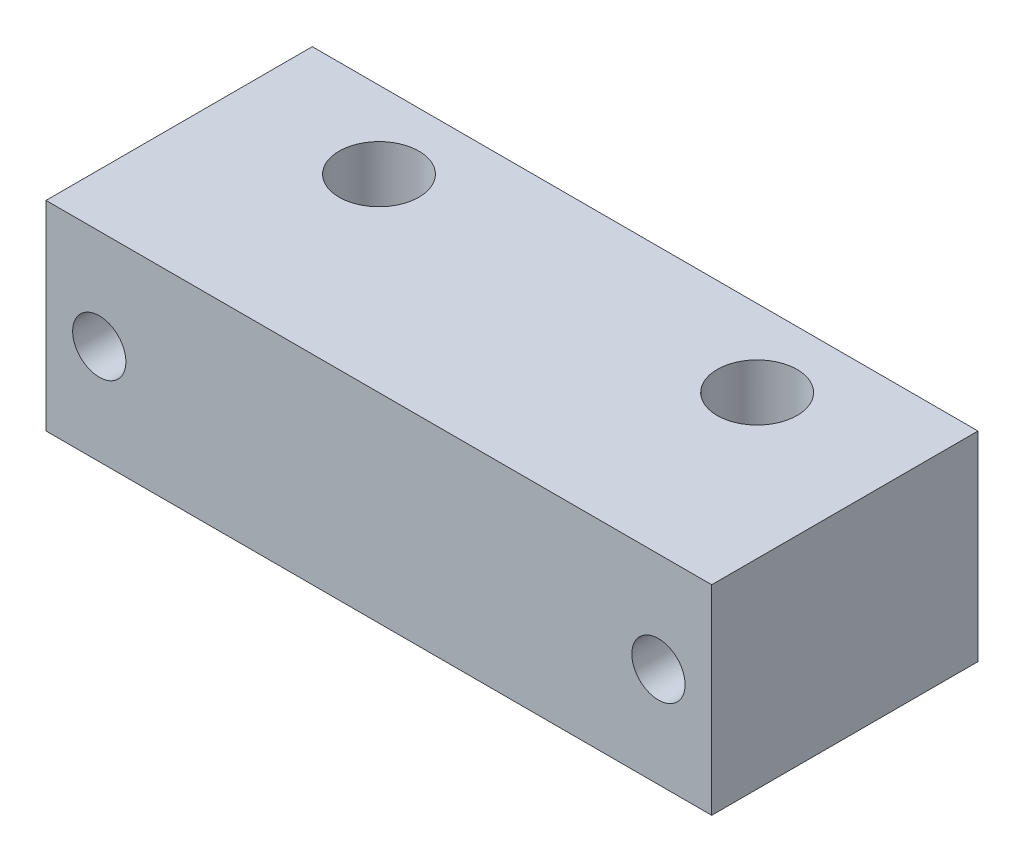
ISO-10303-21;
HEADER;
FILE_DESCRIPTION(('STEP AP214'),'2;1');
FILE_NAME('part.step','',(''),(''),'','','');
FILE_SCHEMA(('AUTOMOTIVE_DESIGN { 1 0 10303 214 1 1 1 1 }'));
ENDSEC;
DATA;
#1=APPLICATION_CONTEXT('core data for automotive mechanical design processes');
#2=APPLICATION_PROTOCOL_DEFINITION('international standard','automotive_design',2000,#1);
#3=PRODUCT_CONTEXT('',#1,'mechanical');
#4=PRODUCT('Part','Part','',(#3));
#5=PRODUCT_RELATED_PRODUCT_CATEGORY('part','',(#4));
#6=PRODUCT_DEFINITION_FORMATION('','',#4);
#7=PRODUCT_DEFINITION_CONTEXT('part definition',#1,'design');
#8=PRODUCT_DEFINITION('design','',#6,#7);
#9=PRODUCT_DEFINITION_SHAPE('','',#8);
#10=(LENGTH_UNIT() NAMED_UNIT(*) SI_UNIT(.MILLI.,.METRE.));
#11=(NAMED_UNIT(*) PLANE_ANGLE_UNIT() SI_UNIT($,.RADIAN.));
#12=(NAMED_UNIT(*) SI_UNIT($,.STERADIAN.) SOLID_ANGLE_UNIT());
#13=UNCERTAINTY_MEASURE_WITH_UNIT(LENGTH_MEASURE(1.E-05),#10,'distance_accuracy_value','');
#14=(GEOMETRIC_REPRESENTATION_CONTEXT(3) GLOBAL_UNCERTAINTY_ASSIGNED_CONTEXT((#13)) GLOBAL_UNIT_ASSIGNED_CONTEXT((#10,
#11,#12)) REPRESENTATION_CONTEXT('',''));
#15=CARTESIAN_POINT('',(0.,0.,0.));
#16=DIRECTION('',(0.,0.,1.));
#17=DIRECTION('',(1.,0.,0.));
#18=AXIS2_PLACEMENT_3D('',#15,#16,#17);
#19=CARTESIAN_POINT('',(49.441456613004,15.,0.));
#20=DIRECTION('',(1.,0.,0.));
#21=DIRECTION('',(0.,0.,-1.));
#22=AXIS2_PLACEMENT_3D('',#19,#20,#21);
#23=PLANE('',#22);
#24=DIRECTION('',(0.,0.,1.));
#25=VECTOR('',#24,1.);
#26=CARTESIAN_POINT('',(49.441456613004,0.,0.));
#27=LINE('',#26,#25);
#28=CARTESIAN_POINT('',(49.441456613004,0.,-41.));
#29=VERTEX_POINT('',#28);
#30=CARTESIAN_POINT('',(49.441456613004,0.,-21.));
#31=VERTEX_POINT('',#30);
#32=EDGE_CURVE('E116',#29,#31,#27,.T.);
#33=ORIENTED_EDGE('',*,*,#32,.F.);
#34=DIRECTION('',(0.,-1.,0.));
#35=VECTOR('',#34,1.);
#36=CARTESIAN_POINT('',(49.441456613004,15.,-41.));
#37=LINE('',#36,#35);
#38=CARTESIAN_POINT('',(49.441456613004,15.,-41.));
#39=VERTEX_POINT('',#38);
#40=EDGE_CURVE('E11',#39,#29,#37,.T.);
#41=ORIENTED_EDGE('',*,*,#40,.F.);
#42=DIRECTION('',(0.,0.,1.));
#43=VECTOR('',#42,1.);
#44=CARTESIAN_POINT('',(49.441456613004,15.,0.));
#45=LINE('',#44,#43);
#46=CARTESIAN_POINT('',(49.441456613004,15.,-21.));
#47=VERTEX_POINT('',#46);
#48=EDGE_CURVE('E101',#39,#47,#45,.T.);
#49=ORIENTED_EDGE('',*,*,#48,.T.);
#50=DIRECTION('',(0.,-1.,0.));
#51=VECTOR('',#50,1.);
#52=CARTESIAN_POINT('',(49.441456613004,15.,-21.));
#53=LINE('',#52,#51);
#54=EDGE_CURVE('E61',#47,#31,#53,.T.);
#55=ORIENTED_EDGE('',*,*,#54,.T.);
#56=EDGE_LOOP('',(#33,#41,#49,#55));
#57=FACE_BOUND('',#56,.T.);
#58=ADVANCED_FACE('F37',(#57),#23,.T.);
#59=CARTESIAN_POINT('',(0.,15.,-41.));
#60=DIRECTION('',(0.,0.,-1.));
#61=DIRECTION('',(-1.,0.,0.));
#62=AXIS2_PLACEMENT_3D('',#59,#60,#61);
#63=PLANE('',#62);
#64=CARTESIAN_POINT('',(10.241456613004,7.5,-41.));
#65=DIRECTION('',(0.,0.,-1.));
#66=DIRECTION('',(-1.,0.,0.));
#67=AXIS2_PLACEMENT_3D('',#64,#65,#66);
#68=CIRCLE('',#67,2.);
#69=CARTESIAN_POINT('',(8.24145661300399,7.5,-41.));
#70=VERTEX_POINT('',#69);
#71=EDGE_CURVE('E132',#70,#70,#68,.T.);
#72=ORIENTED_EDGE('',*,*,#71,.F.);
#73=EDGE_LOOP('',(#72));
#74=FACE_BOUND('',#73,.T.);
#75=CARTESIAN_POINT('',(38.641456613004,7.5,-41.));
#76=DIRECTION('',(0.,0.,-1.));
#77=DIRECTION('',(-1.,0.,0.));
#78=AXIS2_PLACEMENT_3D('',#75,#76,#77);
#79=CIRCLE('',#78,2.);
#80=CARTESIAN_POINT('',(36.641456613004,7.5,-41.));
#81=VERTEX_POINT('',#80);
#82=EDGE_CURVE('E199',#81,#81,#79,.T.);
#83=ORIENTED_EDGE('',*,*,#82,.F.);
#84=EDGE_LOOP('',(#83));
#85=FACE_BOUND('',#84,.T.);
#86=CARTESIAN_POINT('',(3.44145661300399,7.5,-41.));
#87=DIRECTION('',(0.,0.,-1.));
#88=DIRECTION('',(-1.,0.,0.));
#89=AXIS2_PLACEMENT_3D('',#86,#87,#88);
#90=CIRCLE('',#89,2.);
#91=CARTESIAN_POINT('',(1.44145661300399,7.5,-41.));
#92=VERTEX_POINT('',#91);
#93=EDGE_CURVE('E194',#92,#92,#90,.T.);
#94=ORIENTED_EDGE('',*,*,#93,.F.);
#95=EDGE_LOOP('',(#94));
#96=FACE_BOUND('',#95,.T.);
#97=CARTESIAN_POINT('',(45.441456613004,7.5,-41.));
#98=DIRECTION('',(0.,0.,-1.));
#99=DIRECTION('',(-1.,0.,0.));
#100=AXIS2_PLACEMENT_3D('',#97,#98,#99);
#101=CIRCLE('',#100,2.);
#102=CARTESIAN_POINT('',(43.441456613004,7.5,-41.));
#103=VERTEX_POINT('',#102);
#104=EDGE_CURVE('E188',#103,#103,#101,.T.);
#105=ORIENTED_EDGE('',*,*,#104,.F.);
#106=EDGE_LOOP('',(#105));
#107=FACE_BOUND('',#106,.T.);
#108=DIRECTION('',(1.,0.,0.));
#109=VECTOR('',#108,1.);
#110=CARTESIAN_POINT('',(0.,0.,-41.));
#111=LINE('',#110,#109);
#112=CARTESIAN_POINT('',(-0.558543386996006,0.,-41.));
#113=VERTEX_POINT('',#112);
#114=EDGE_CURVE('E91',#113,#29,#111,.T.);
#115=ORIENTED_EDGE('',*,*,#114,.F.);
#116=DIRECTION('',(0.,-1.,0.));
#117=VECTOR('',#116,1.);
#118=CARTESIAN_POINT('',(-0.558543386996006,15.,-41.));
#119=LINE('',#118,#117);
#120=CARTESIAN_POINT('',(-0.558543386996006,15.,-41.));
#121=VERTEX_POINT('',#120);
#122=EDGE_CURVE('E52',#121,#113,#119,.T.);
#123=ORIENTED_EDGE('',*,*,#122,.F.);
#124=DIRECTION('',(1.,0.,0.));
#125=VECTOR('',#124,1.);
#126=CARTESIAN_POINT('',(0.,15.,-41.));
#127=LINE('',#126,#125);
#128=EDGE_CURVE('E89',#121,#39,#127,.T.);
#129=ORIENTED_EDGE('',*,*,#128,.T.);
#130=ORIENTED_EDGE('',*,*,#40,.T.);
#131=EDGE_LOOP('',(#115,#123,#129,#130));
#132=FACE_BOUND('',#131,.T.);
#133=ADVANCED_FACE('F88',(#74,#85,#96,#107,#132),#63,.T.);
#134=CARTESIAN_POINT('',(-0.558543386996006,15.,0.));
#135=DIRECTION('',(-1.,0.,0.));
#136=DIRECTION('',(0.,0.,1.));
#137=AXIS2_PLACEMENT_3D('',#134,#135,#136);
#138=PLANE('',#137);
#139=DIRECTION('',(0.,0.,-1.));
#140=VECTOR('',#139,1.);
#141=CARTESIAN_POINT('',(-0.558543386996006,0.,0.));
#142=LINE('',#141,#140);
#143=CARTESIAN_POINT('',(-0.558543386996006,0.,-21.));
#144=VERTEX_POINT('',#143);
#145=EDGE_CURVE('E119',#144,#113,#142,.T.);
#146=ORIENTED_EDGE('',*,*,#145,.F.);
#147=DIRECTION('',(0.,-1.,0.));
#148=VECTOR('',#147,1.);
#149=CARTESIAN_POINT('',(-0.558543386996006,15.,-21.));
#150=LINE('',#149,#148);
#151=CARTESIAN_POINT('',(-0.558543386996006,15.,-21.));
#152=VERTEX_POINT('',#151);
#153=EDGE_CURVE('E74',#152,#144,#150,.T.);
#154=ORIENTED_EDGE('',*,*,#153,.F.);
#155=DIRECTION('',(0.,0.,-1.));
#156=VECTOR('',#155,1.);
#157=CARTESIAN_POINT('',(-0.558543386996006,15.,0.));
#158=LINE('',#157,#156);
#159=EDGE_CURVE('E100',#152,#121,#158,.T.);
#160=ORIENTED_EDGE('',*,*,#159,.T.);
#161=ORIENTED_EDGE('',*,*,#122,.T.);
#162=EDGE_LOOP('',(#146,#154,#160,#161));
#163=FACE_BOUND('',#162,.T.);
#164=ADVANCED_FACE('F103',(#163),#138,.T.);
#165=CARTESIAN_POINT('',(10.241456613004,15.,-35.2107775480874));
#166=DIRECTION('',(0.,-1.,0.));
#167=DIRECTION('',(0.,0.,-1.));
#168=AXIS2_PLACEMENT_3D('',#165,#166,#167);
#169=CYLINDRICAL_SURFACE('',#168,3.);
#170=CARTESIAN_POINT('',(10.241456613004,9.5,-38.2107775480874));
#171=CARTESIAN_POINT('',(10.1409718963359,9.50000054963247,-38.2107779645358));
#172=CARTESIAN_POINT('',(10.0404875258711,9.4923860300445,-38.2056855756213));
#173=CARTESIAN_POINT('',(9.84272355497231,9.46240313589434,-38.1858240723255));
#174=CARTESIAN_POINT('',(9.74544549904899,9.4400277568767,-38.1710503638998));
#175=CARTESIAN_POINT('',(9.55724430514974,9.38189228267516,-38.1332823721345));
#176=CARTESIAN_POINT('',(9.46629374034644,9.34619485999206,-38.1103266030206));
#177=CARTESIAN_POINT('',(9.29204132200673,9.2629366367285,-38.0580389268618));
#178=CARTESIAN_POINT('',(9.20874058139432,9.21537411369943,-38.0287060941425));
#179=CARTESIAN_POINT('',(9.04417191223388,9.10534306263257,-37.9630508417858));
#180=CARTESIAN_POINT('',(8.96367630754332,9.0419521392571,-37.9263465238806));
#181=CARTESIAN_POINT('',(8.81372856831125,8.90426995134155,-37.8506006789221));
#182=CARTESIAN_POINT('',(8.74429255756511,8.82996307016226,-37.8115558516558));
#183=CARTESIAN_POINT('',(8.60723363554903,8.65894763238732,-37.7280601948754));
#184=CARTESIAN_POINT('',(8.54162474937649,8.56055434679654,-37.6837282274654));
#185=CARTESIAN_POINT('',(8.42795304286225,8.35163662235346,-37.6016190216156));
#186=CARTESIAN_POINT('',(8.37985987873897,8.24113359843725,-37.5638305076341));
#187=CARTESIAN_POINT('',(8.31471626288961,8.04328870657837,-37.510540214502));
#188=CARTESIAN_POINT('',(8.29271214064391,7.95847154712609,-37.4917538270115));
#189=CARTESIAN_POINT('',(8.25995043515171,7.78525549525835,-37.4633572446835));
#190=CARTESIAN_POINT('',(8.24917346648436,7.69686305127394,-37.4537312355289));
#191=CARTESIAN_POINT('',(8.23954297159172,7.51852522114353,-37.4451436041679));
#192=CARTESIAN_POINT('',(8.24073818382876,7.4285749765476,-37.4462255736725));
#193=CARTESIAN_POINT('',(8.25508079967044,7.25036502650024,-37.4589753029217));
#194=CARTESIAN_POINT('',(8.26823832920007,7.16210681797187,-37.4706520309562));
#195=CARTESIAN_POINT('',(8.30480667083074,6.99353294875812,-37.502049407987));
#196=CARTESIAN_POINT('',(8.32773949820922,6.91303866406123,-37.5213924313312));
#197=CARTESIAN_POINT('',(8.38275542716976,6.75697630902422,-37.5658737774237));
#198=CARTESIAN_POINT('',(8.41484153971849,6.68140986976135,-37.5910140066363));
#199=CARTESIAN_POINT('',(8.49471842567751,6.52097460464355,-37.6504195118669));
#200=CARTESIAN_POINT('',(8.54437608999955,6.4373400995169,-37.6855007254937));
#201=CARTESIAN_POINT('',(8.65476700862179,6.27861660471425,-37.7576929254218));
#202=CARTESIAN_POINT('',(8.71551392300786,6.20353834223792,-37.7948063751807));
#203=CARTESIAN_POINT('',(8.86164495978091,6.04745745439658,-37.8762109857247));
#204=CARTESIAN_POINT('',(8.94951723016744,5.96866595131723,-37.920324995293));
#205=CARTESIAN_POINT('',(9.13944861392392,5.82680350546151,-38.0029585547395));
#206=CARTESIAN_POINT('',(9.2414943136603,5.76371785459102,-38.0414833245678));
#207=CARTESIAN_POINT('',(9.43659878590747,5.66652228137713,-38.1022315889911));
#208=CARTESIAN_POINT('',(9.52749896963208,5.62915663666106,-38.1261701597428));
#209=CARTESIAN_POINT('',(9.71542056906851,5.56789507437463,-38.1658547383924));
#210=CARTESIAN_POINT('',(9.81243673400234,5.54398777286778,-38.1816076693629));
#211=CARTESIAN_POINT('',(10.0104711598317,5.510838834762,-38.2035363696555));
#212=CARTESIAN_POINT('',(10.1115048010698,5.50166053906174,-38.2096707726993));
#213=CARTESIAN_POINT('',(10.3138981323933,5.49875291143779,-38.2116086977389));
#214=CARTESIAN_POINT('',(10.4152577991906,5.50502249951123,-38.2074129419438));
#215=CARTESIAN_POINT('',(10.6079123302082,5.53162405556195,-38.1897734423302));
#216=CARTESIAN_POINT('',(10.6994140576832,5.55093729775522,-38.1770000119897));
#217=CARTESIAN_POINT('',(10.8775730054314,5.60159568601286,-38.1439620409358));
#218=CARTESIAN_POINT('',(10.9642294505751,5.63294275092821,-38.1236963055573));
#219=CARTESIAN_POINT('',(11.13612136347,5.70865229704492,-38.075741073379));
#220=CARTESIAN_POINT('',(11.2209527976354,5.75368815408185,-38.0476762494453));
#221=CARTESIAN_POINT('',(11.3821396369613,5.85443328994627,-37.9867961042025));
#222=CARTESIAN_POINT('',(11.4584897612049,5.91014916053217,-37.9539778521268));
#223=CARTESIAN_POINT('',(11.6133110678272,6.04060786815751,-37.8803230146217));
#224=CARTESIAN_POINT('',(11.6902084886996,6.11696626007509,-37.8390391160891));
#225=CARTESIAN_POINT('',(11.8307962936985,6.28111142995711,-37.756489278947));
#226=CARTESIAN_POINT('',(11.8944775495763,6.3689060391075,-37.7152233722659));
#227=CARTESIAN_POINT('',(12.0027043784971,6.54714241276812,-37.6401743377932));
#228=CARTESIAN_POINT('',(12.0484129742568,6.63673203346221,-37.6060535183444));
#229=CARTESIAN_POINT('',(12.1264187504066,6.82387265244363,-37.545167290749));
#230=CARTESIAN_POINT('',(12.1587400698259,6.92140893830463,-37.5183886733856));
#231=CARTESIAN_POINT('',(12.2038150476574,7.10456448719541,-37.4801096299138));
#232=CARTESIAN_POINT('',(12.2190425886662,7.18917180987601,-37.4667275283));
#233=CARTESIAN_POINT('',(12.2384486722377,7.36057328131839,-37.4495722124714));
#234=CARTESIAN_POINT('',(12.2426392158572,7.4473649511395,-37.4457885615656));
#235=CARTESIAN_POINT('',(12.2396958328167,7.6206430567237,-37.4484195595873));
#236=CARTESIAN_POINT('',(12.2325552006818,7.70712928137376,-37.4548402471621));
#237=CARTESIAN_POINT('',(12.2074265852515,7.87734352853212,-37.4768820721223));
#238=CARTESIAN_POINT('',(12.1894241302866,7.96106771382433,-37.4925154833636));
#239=CARTESIAN_POINT('',(12.1373869695789,8.14571118648124,-37.5360459871354));
#240=CARTESIAN_POINT('',(12.1003584843116,8.24526771294333,-37.5661008838373));
#241=CARTESIAN_POINT('',(12.0123018753662,8.43548683438421,-37.6329991593005));
#242=CARTESIAN_POINT('',(11.9612540964166,8.52613669799169,-37.6698520449544));
#243=CARTESIAN_POINT('',(11.8454394185555,8.69928188713623,-37.7469494138586));
#244=CARTESIAN_POINT('',(11.7804397119442,8.78159874542305,-37.7872434220102));
#245=CARTESIAN_POINT('',(11.6381742933149,8.93532247825793,-37.8670605634659));
#246=CARTESIAN_POINT('',(11.5609048232615,9.00672599702921,-37.9065834564114));
#247=CARTESIAN_POINT('',(11.3829139427737,9.14671210430908,-37.9870930677283));
#248=CARTESIAN_POINT('',(11.2804182825597,9.21341864017832,-38.0274756025873));
#249=CARTESIAN_POINT('',(11.0623251687752,9.3279132766653,-38.098554206829));
#250=CARTESIAN_POINT('',(10.9467486754531,9.37573110682395,-38.12926548254));
#251=CARTESIAN_POINT('',(10.7328916828397,9.44115457816378,-38.1717939964564));
#252=CARTESIAN_POINT('',(10.6364689382619,9.46311103909862,-38.1862923517768));
#253=CARTESIAN_POINT('',(10.4405146250279,9.49252803253809,-38.205780349506));
#254=CARTESIAN_POINT('',(10.340985449192,9.49999945559601,-38.2107771356006));
#255=CARTESIAN_POINT('',(10.241456613004,9.5,-38.2107775480874));
#256=B_SPLINE_CURVE_WITH_KNOTS('',3,(#170,#171,#172,#173,#174,#175,#176,#177,#178,#179,#180,
#181,#182,#183,#184,#185,#186,#187,#188,#189,#190,#191,#192,#193,#194,#195,#196,#197,#198,#199,
#200,#201,#202,#203,#204,#205,#206,#207,#208,#209,#210,#211,#212,#213,#214,#215,#216,#217,#218,
#219,#220,#221,#222,#223,#224,#225,#226,#227,#228,#229,#230,#231,#232,#233,#234,#235,#236,#237,
#238,#239,#240,#241,#242,#243,#244,#245,#246,#247,#248,#249,#250,#251,#252,#253,#254,#255),
.UNSPECIFIED.,.T.,.F.,(4,2,2,2,2,2,2,2,2,2,2,2,2,2,2,2,2,2,2,2,2,2,2,2,2,2,2,2,2,2,2,2,2,2,2,2,
2,2,2,2,2,2,4),(0.,0.301053226505399,0.602249414348689,0.902046153190232,1.20188643867387,
1.52717029000557,1.85292411604319,2.23006683295982,2.60655305445439,2.87433693676029,
3.14165767845809,3.41006711735378,3.67870397263352,3.93548862198021,4.19235783805078,
4.50147574660873,4.81097703780057,5.18718954496752,5.56304840301362,5.86524087696757,
6.16717735142812,6.4704088329425,6.77361911533414,7.05553084792471,7.33748755138269,
7.63652346829515,7.93574454945203,8.2822817614129,8.62905753175757,8.94649935304475,
9.26336626640722,9.52324048016134,9.7828320033309,10.0425772028455,10.302669238524,
10.6320660870419,10.9619271337795,11.2977924520448,11.6337608397015,12.0179535155883,
12.4015390656082,12.6999529136674,12.9981423125957),.UNSPECIFIED.);
#257=CARTESIAN_POINT('',(10.241456613004,9.5,-38.2107775480874));
#258=VERTEX_POINT('',#257);
#259=EDGE_CURVE('E42',#258,#258,#256,.T.);
#260=ORIENTED_EDGE('',*,*,#259,.F.);
#261=EDGE_LOOP('',(#260));
#262=FACE_BOUND('',#261,.T.);
#263=CARTESIAN_POINT('',(10.241456613004,15.,-35.2107775480874));
#264=DIRECTION('',(0.,1.,0.));
#265=DIRECTION('',(0.,0.,1.));
#266=AXIS2_PLACEMENT_3D('',#263,#264,#265);
#267=CIRCLE('',#266,3.);
#268=CARTESIAN_POINT('',(10.241456613004,15.,-32.2107775480874));
#269=VERTEX_POINT('',#268);
#270=EDGE_CURVE('E179',#269,#269,#267,.T.);
#271=ORIENTED_EDGE('',*,*,#270,.T.);
#272=EDGE_LOOP('',(#271));
#273=FACE_BOUND('',#272,.T.);
#274=CARTESIAN_POINT('',(10.241456613004,0.,-35.2107775480874));
#275=DIRECTION('',(0.,1.,0.));
#276=DIRECTION('',(0.,0.,1.));
#277=AXIS2_PLACEMENT_3D('',#274,#275,#276);
#278=CIRCLE('',#277,3.);
#279=CARTESIAN_POINT('',(10.241456613004,0.,-32.2107775480874));
#280=VERTEX_POINT('',#279);
#281=EDGE_CURVE('E112',#280,#280,#278,.T.);
#282=ORIENTED_EDGE('',*,*,#281,.F.);
#283=EDGE_LOOP('',(#282));
#284=FACE_BOUND('',#283,.T.);
#285=ADVANCED_FACE('F161',(#262,#273,#284),#169,.F.);
#286=CARTESIAN_POINT('',(38.641456613004,15.,-35.2107775480874));
#287=DIRECTION('',(0.,-1.,0.));
#288=DIRECTION('',(0.,0.,-1.));
#289=AXIS2_PLACEMENT_3D('',#286,#287,#288);
#290=CYLINDRICAL_SURFACE('',#289,3.);
#291=CARTESIAN_POINT('',(38.641456613004,9.5,-38.2107775480874));
#292=CARTESIAN_POINT('',(38.5409718963359,9.50000054963247,-38.2107779645358));
#293=CARTESIAN_POINT('',(38.4404875258711,9.4923860300445,-38.2056855756213));
#294=CARTESIAN_POINT('',(38.2427235549723,9.46240313589434,-38.1858240723255));
#295=CARTESIAN_POINT('',(38.145445499049,9.44002775687671,-38.1710503638998));
#296=CARTESIAN_POINT('',(37.9572443051498,9.38189228267516,-38.1332823721345));
#297=CARTESIAN_POINT('',(37.8662937403464,9.34619485999206,-38.1103266030206));
#298=CARTESIAN_POINT('',(37.6920413220067,9.2629366367285,-38.0580389268618));
#299=CARTESIAN_POINT('',(37.6087405813943,9.21537411369944,-38.0287060941425));
#300=CARTESIAN_POINT('',(37.4441719122339,9.10534306263257,-37.9630508417858));
#301=CARTESIAN_POINT('',(37.3636763075433,9.0419521392571,-37.9263465238806));
#302=CARTESIAN_POINT('',(37.2137285683113,8.90426995134155,-37.8506006789221));
#303=CARTESIAN_POINT('',(37.1442925575651,8.82996307016226,-37.8115558516558));
#304=CARTESIAN_POINT('',(37.007233635549,8.65894763238732,-37.7280601948754));
#305=CARTESIAN_POINT('',(36.9416247493765,8.56055434679654,-37.6837282274654));
#306=CARTESIAN_POINT('',(36.8279530428622,8.35163662235346,-37.6016190216156));
#307=CARTESIAN_POINT('',(36.779859878739,8.24113359843725,-37.5638305076341));
#308=CARTESIAN_POINT('',(36.7147162628896,8.04328870657836,-37.510540214502));
#309=CARTESIAN_POINT('',(36.6927121406439,7.95847154712608,-37.4917538270115));
#310=CARTESIAN_POINT('',(36.6599504351517,7.78525549525834,-37.4633572446835));
#311=CARTESIAN_POINT('',(36.6491734664844,7.69686305127393,-37.4537312355289));
#312=CARTESIAN_POINT('',(36.6395429715917,7.51852522114352,-37.4451436041679));
#313=CARTESIAN_POINT('',(36.6407381838288,7.42857497654759,-37.4462255736725));
#314=CARTESIAN_POINT('',(36.6550807996704,7.25036502650024,-37.4589753029217));
#315=CARTESIAN_POINT('',(36.6682383292001,7.16210681797186,-37.4706520309563));
#316=CARTESIAN_POINT('',(36.7048066708307,6.99353294875811,-37.502049407987));
#317=CARTESIAN_POINT('',(36.7277394982092,6.91303866406122,-37.5213924313312));
#318=CARTESIAN_POINT('',(36.7827554271698,6.75697630902421,-37.5658737774237));
#319=CARTESIAN_POINT('',(36.8148415397185,6.68140986976134,-37.5910140066363));
#320=CARTESIAN_POINT('',(36.8947184256775,6.52097460464355,-37.6504195118669));
#321=CARTESIAN_POINT('',(36.9443760899996,6.43734009951689,-37.6855007254937));
#322=CARTESIAN_POINT('',(37.0547670086218,6.27861660471424,-37.7576929254218));
#323=CARTESIAN_POINT('',(37.1155139230079,6.20353834223792,-37.7948063751807));
#324=CARTESIAN_POINT('',(37.2616449597809,6.04745745439657,-37.8762109857247));
#325=CARTESIAN_POINT('',(37.3495172301674,5.96866595131723,-37.9203249952931));
#326=CARTESIAN_POINT('',(37.5394486139239,5.82680350546151,-38.0029585547396));
#327=CARTESIAN_POINT('',(37.6414943136603,5.76371785459101,-38.0414833245679));
#328=CARTESIAN_POINT('',(37.8365987859075,5.66652228137712,-38.1022315889911));
#329=CARTESIAN_POINT('',(37.9274989696321,5.62915663666106,-38.1261701597428));
#330=CARTESIAN_POINT('',(38.1154205690685,5.56789507437463,-38.1658547383924));
#331=CARTESIAN_POINT('',(38.2124367340024,5.54398777286778,-38.1816076693629));
#332=CARTESIAN_POINT('',(38.4104711598317,5.510838834762,-38.2035363696555));
#333=CARTESIAN_POINT('',(38.5115048010699,5.50166053906174,-38.2096707726993));
#334=CARTESIAN_POINT('',(38.7138981323933,5.49875291143779,-38.2116086977389));
#335=CARTESIAN_POINT('',(38.8152577991906,5.50502249951122,-38.2074129419438));
#336=CARTESIAN_POINT('',(39.0079123302082,5.53162405556195,-38.1897734423302));
#337=CARTESIAN_POINT('',(39.0994140576832,5.55093729775522,-38.1770000119897));
#338=CARTESIAN_POINT('',(39.2775730054314,5.60159568601286,-38.1439620409358));
#339=CARTESIAN_POINT('',(39.3642294505751,5.63294275092821,-38.1236963055573));
#340=CARTESIAN_POINT('',(39.53612136347,5.70865229704492,-38.075741073379));
#341=CARTESIAN_POINT('',(39.6209527976354,5.75368815408186,-38.0476762494453));
#342=CARTESIAN_POINT('',(39.7821396369613,5.85443328994628,-37.9867961042025));
#343=CARTESIAN_POINT('',(39.8584897612049,5.91014916053217,-37.9539778521268));
#344=CARTESIAN_POINT('',(40.0133110678272,6.04060786815751,-37.8803230146217));
#345=CARTESIAN_POINT('',(40.0902084886997,6.11696626007509,-37.8390391160891));
#346=CARTESIAN_POINT('',(40.2307962936985,6.28111142995712,-37.756489278947));
#347=CARTESIAN_POINT('',(40.2944775495763,6.36890603910751,-37.7152233722659));
#348=CARTESIAN_POINT('',(40.4027043784971,6.54714241276813,-37.6401743377932));
#349=CARTESIAN_POINT('',(40.4484129742568,6.63673203346221,-37.6060535183444));
#350=CARTESIAN_POINT('',(40.5264187504066,6.82387265244364,-37.545167290749));
#351=CARTESIAN_POINT('',(40.5587400698259,6.92140893830463,-37.5183886733856));
#352=CARTESIAN_POINT('',(40.6038150476574,7.10456448719542,-37.4801096299138));
#353=CARTESIAN_POINT('',(40.6190425886663,7.18917180987602,-37.4667275283));
#354=CARTESIAN_POINT('',(40.6384486722377,7.36057328131839,-37.4495722124714));
#355=CARTESIAN_POINT('',(40.6426392158572,7.4473649511395,-37.4457885615656));
#356=CARTESIAN_POINT('',(40.6396958328167,7.6206430567237,-37.4484195595873));
#357=CARTESIAN_POINT('',(40.6325552006818,7.70712928137376,-37.4548402471621));
#358=CARTESIAN_POINT('',(40.6074265852515,7.87734352853212,-37.4768820721223));
#359=CARTESIAN_POINT('',(40.5894241302866,7.96106771382433,-37.4925154833636));
#360=CARTESIAN_POINT('',(40.5373869695789,8.14571118648124,-37.5360459871354));
#361=CARTESIAN_POINT('',(40.5003584843116,8.24526771294333,-37.5661008838373));
#362=CARTESIAN_POINT('',(40.4123018753662,8.43548683438421,-37.6329991593005));
#363=CARTESIAN_POINT('',(40.3612540964166,8.52613669799169,-37.6698520449544));
#364=CARTESIAN_POINT('',(40.2454394185555,8.69928188713623,-37.7469494138586));
#365=CARTESIAN_POINT('',(40.1804397119442,8.78159874542305,-37.7872434220102));
#366=CARTESIAN_POINT('',(40.0381742933149,8.93532247825793,-37.8670605634659));
#367=CARTESIAN_POINT('',(39.9609048232615,9.00672599702921,-37.9065834564114));
#368=CARTESIAN_POINT('',(39.7829139427737,9.14671210430908,-37.9870930677283));
#369=CARTESIAN_POINT('',(39.6804182825597,9.21341864017832,-38.0274756025873));
#370=CARTESIAN_POINT('',(39.4623251687752,9.3279132766653,-38.098554206829));
#371=CARTESIAN_POINT('',(39.3467486754532,9.37573110682395,-38.12926548254));
#372=CARTESIAN_POINT('',(39.1328916828397,9.44115457816379,-38.1717939964564));
#373=CARTESIAN_POINT('',(39.0364689382619,9.46311103909862,-38.1862923517768));
#374=CARTESIAN_POINT('',(38.8405146250279,9.4925280325381,-38.205780349506));
#375=CARTESIAN_POINT('',(38.740985449192,9.49999945559601,-38.2107771356006));
#376=CARTESIAN_POINT('',(38.641456613004,9.5,-38.2107775480874));
#377=B_SPLINE_CURVE_WITH_KNOTS('',3,(#291,#292,#293,#294,#295,#296,#297,#298,#299,#300,#301,
#302,#303,#304,#305,#306,#307,#308,#309,#310,#311,#312,#313,#314,#315,#316,#317,#318,#319,#320,
#321,#322,#323,#324,#325,#326,#327,#328,#329,#330,#331,#332,#333,#334,#335,#336,#337,#338,#339,
#340,#341,#342,#343,#344,#345,#346,#347,#348,#349,#350,#351,#352,#353,#354,#355,#356,#357,#358,
#359,#360,#361,#362,#363,#364,#365,#366,#367,#368,#369,#370,#371,#372,#373,#374,#375,#376),
.UNSPECIFIED.,.T.,.F.,(4,2,2,2,2,2,2,2,2,2,2,2,2,2,2,2,2,2,2,2,2,2,2,2,2,2,2,2,2,2,2,2,2,2,2,2,
2,2,2,2,2,2,4),(0.,0.301053226505401,0.602249414348689,0.902046153190229,1.20188643867386,
1.52717029000557,1.85292411604319,2.23006683295983,2.60655305445439,2.8743369367603,
3.14165767845809,3.41006711735378,3.67870397263353,3.93548862198022,4.19235783805079,
4.50147574660874,4.81097703780058,5.18718954496753,5.56304840301363,5.86524087696758,
6.16717735142814,6.47040883294251,6.77361911533416,7.05553084792473,7.33748755138271,
7.63652346829516,7.93574454945204,8.28228176141292,8.62905753175758,8.94649935304476,
9.26336626640723,9.52324048016135,9.78283200333092,10.0425772028455,10.302669238524,
10.6320660870419,10.9619271337795,11.2977924520448,11.6337608397015,12.0179535155883,
12.4015390656083,12.6999529136674,12.9981423125957),.UNSPECIFIED.);
#378=CARTESIAN_POINT('',(38.641456613004,9.5,-38.2107775480874));
#379=VERTEX_POINT('',#378);
#380=EDGE_CURVE('E126',#379,#379,#377,.T.);
#381=ORIENTED_EDGE('',*,*,#380,.F.);
#382=EDGE_LOOP('',(#381));
#383=FACE_BOUND('',#382,.T.);
#384=CARTESIAN_POINT('',(38.641456613004,15.,-35.2107775480874));
#385=DIRECTION('',(0.,1.,0.));
#386=DIRECTION('',(0.,0.,1.));
#387=AXIS2_PLACEMENT_3D('',#384,#385,#386);
#388=CIRCLE('',#387,3.);
#389=CARTESIAN_POINT('',(38.641456613004,15.,-32.2107775480874));
#390=VERTEX_POINT('',#389);
#391=EDGE_CURVE('E124',#390,#390,#388,.T.);
#392=ORIENTED_EDGE('',*,*,#391,.T.);
#393=EDGE_LOOP('',(#392));
#394=FACE_BOUND('',#393,.T.);
#395=CARTESIAN_POINT('',(38.641456613004,0.,-35.2107775480874));
#396=DIRECTION('',(0.,1.,0.));
#397=DIRECTION('',(0.,0.,1.));
#398=AXIS2_PLACEMENT_3D('',#395,#396,#397);
#399=CIRCLE('',#398,3.);
#400=CARTESIAN_POINT('',(38.641456613004,0.,-32.2107775480874));
#401=VERTEX_POINT('',#400);
#402=EDGE_CURVE('E109',#401,#401,#399,.T.);
#403=ORIENTED_EDGE('',*,*,#402,.F.);
#404=EDGE_LOOP('',(#403));
#405=FACE_BOUND('',#404,.T.);
#406=ADVANCED_FACE('F39',(#383,#394,#405),#290,.F.);
#407=CARTESIAN_POINT('',(0.,15.,-21.));
#408=DIRECTION('',(0.,0.,1.));
#409=DIRECTION('',(1.,0.,0.));
#410=AXIS2_PLACEMENT_3D('',#407,#408,#409);
#411=PLANE('',#410);
#412=CARTESIAN_POINT('',(3.44145661300399,7.5,-21.));
#413=DIRECTION('',(0.,0.,-1.));
#414=DIRECTION('',(-1.,0.,0.));
#415=AXIS2_PLACEMENT_3D('',#412,#413,#414);
#416=CIRCLE('',#415,2.);
#417=CARTESIAN_POINT('',(1.44145661300399,7.5,-21.));
#418=VERTEX_POINT('',#417);
#419=EDGE_CURVE('E113',#418,#418,#416,.T.);
#420=ORIENTED_EDGE('',*,*,#419,.T.);
#421=EDGE_LOOP('',(#420));
#422=FACE_BOUND('',#421,.T.);
#423=CARTESIAN_POINT('',(45.441456613004,7.5,-21.));
#424=DIRECTION('',(0.,0.,-1.));
#425=DIRECTION('',(-1.,0.,0.));
#426=AXIS2_PLACEMENT_3D('',#423,#424,#425);
#427=CIRCLE('',#426,2.);
#428=CARTESIAN_POINT('',(43.441456613004,7.5,-21.));
#429=VERTEX_POINT('',#428);
#430=EDGE_CURVE('E191',#429,#429,#427,.T.);
#431=ORIENTED_EDGE('',*,*,#430,.T.);
#432=EDGE_LOOP('',(#431));
#433=FACE_BOUND('',#432,.T.);
#434=DIRECTION('',(-1.,0.,0.));
#435=VECTOR('',#434,1.);
#436=CARTESIAN_POINT('',(0.,0.,-21.));
#437=LINE('',#436,#435);
#438=EDGE_CURVE('E121',#31,#144,#437,.T.);
#439=ORIENTED_EDGE('',*,*,#438,.F.);
#440=ORIENTED_EDGE('',*,*,#54,.F.);
#441=DIRECTION('',(-1.,0.,0.));
#442=VECTOR('',#441,1.);
#443=CARTESIAN_POINT('',(0.,15.,-21.));
#444=LINE('',#443,#442);
#445=EDGE_CURVE('E104',#47,#152,#444,.T.);
#446=ORIENTED_EDGE('',*,*,#445,.T.);
#447=ORIENTED_EDGE('',*,*,#153,.T.);
#448=EDGE_LOOP('',(#439,#440,#446,#447));
#449=FACE_BOUND('',#448,.T.);
#450=ADVANCED_FACE('F151',(#422,#433,#449),#411,.T.);
#451=CARTESIAN_POINT('',(0.,15.,0.));
#452=DIRECTION('',(0.,1.,0.));
#453=DIRECTION('',(0.,0.,1.));
#454=AXIS2_PLACEMENT_3D('',#451,#452,#453);
#455=PLANE('',#454);
#456=ORIENTED_EDGE('',*,*,#391,.F.);
#457=EDGE_LOOP('',(#456));
#458=FACE_BOUND('',#457,.T.);
#459=ORIENTED_EDGE('',*,*,#270,.F.);
#460=EDGE_LOOP('',(#459));
#461=FACE_BOUND('',#460,.T.);
#462=ORIENTED_EDGE('',*,*,#48,.F.);
#463=ORIENTED_EDGE('',*,*,#128,.F.);
#464=ORIENTED_EDGE('',*,*,#159,.F.);
#465=ORIENTED_EDGE('',*,*,#445,.F.);
#466=EDGE_LOOP('',(#462,#463,#464,#465));
#467=FACE_BOUND('',#466,.T.);
#468=ADVANCED_FACE('F98',(#458,#461,#467),#455,.T.);
#469=CARTESIAN_POINT('',(0.,0.,0.));
#470=DIRECTION('',(0.,1.,0.));
#471=DIRECTION('',(0.,0.,1.));
#472=AXIS2_PLACEMENT_3D('',#469,#470,#471);
#473=PLANE('',#472);
#474=ORIENTED_EDGE('',*,*,#402,.T.);
#475=EDGE_LOOP('',(#474));
#476=FACE_BOUND('',#475,.T.);
#477=ORIENTED_EDGE('',*,*,#281,.T.);
#478=EDGE_LOOP('',(#477));
#479=FACE_BOUND('',#478,.T.);
#480=ORIENTED_EDGE('',*,*,#32,.T.);
#481=ORIENTED_EDGE('',*,*,#438,.T.);
#482=ORIENTED_EDGE('',*,*,#145,.T.);
#483=ORIENTED_EDGE('',*,*,#114,.T.);
#484=EDGE_LOOP('',(#480,#481,#482,#483));
#485=FACE_BOUND('',#484,.T.);
#486=ADVANCED_FACE('F147',(#476,#479,#485),#473,.F.);
#487=CARTESIAN_POINT('',(45.441456613004,7.5,-21.));
#488=DIRECTION('',(0.,0.,-1.));
#489=DIRECTION('',(-1.,0.,0.));
#490=AXIS2_PLACEMENT_3D('',#487,#488,#489);
#491=CYLINDRICAL_SURFACE('',#490,2.);
#492=ORIENTED_EDGE('',*,*,#430,.F.);
#493=EDGE_LOOP('',(#492));
#494=FACE_BOUND('',#493,.T.);
#495=ORIENTED_EDGE('',*,*,#104,.T.);
#496=EDGE_LOOP('',(#495));
#497=FACE_BOUND('',#496,.T.);
#498=ADVANCED_FACE('F143',(#494,#497),#491,.F.);
#499=CARTESIAN_POINT('',(3.44145661300399,7.5,-21.));
#500=DIRECTION('',(0.,0.,-1.));
#501=DIRECTION('',(-1.,0.,0.));
#502=AXIS2_PLACEMENT_3D('',#499,#500,#501);
#503=CYLINDRICAL_SURFACE('',#502,2.);
#504=ORIENTED_EDGE('',*,*,#419,.F.);
#505=EDGE_LOOP('',(#504));
#506=FACE_BOUND('',#505,.T.);
#507=ORIENTED_EDGE('',*,*,#93,.T.);
#508=EDGE_LOOP('',(#507));
#509=FACE_BOUND('',#508,.T.);
#510=ADVANCED_FACE('F138',(#506,#509),#503,.F.);
#511=CARTESIAN_POINT('',(38.641456613004,7.5,-37.));
#512=DIRECTION('',(0.,0.,-1.));
#513=DIRECTION('',(-1.,0.,0.));
#514=AXIS2_PLACEMENT_3D('',#511,#512,#513);
#515=CYLINDRICAL_SURFACE('',#514,2.);
#516=ORIENTED_EDGE('',*,*,#380,.T.);
#517=EDGE_LOOP('',(#516));
#518=FACE_BOUND('',#517,.T.);
#519=ORIENTED_EDGE('',*,*,#82,.T.);
#520=EDGE_LOOP('',(#519));
#521=FACE_BOUND('',#520,.T.);
#522=ADVANCED_FACE('F133',(#518,#521),#515,.F.);
#523=CARTESIAN_POINT('',(10.241456613004,7.5,-37.));
#524=DIRECTION('',(0.,0.,-1.));
#525=DIRECTION('',(-1.,0.,0.));
#526=AXIS2_PLACEMENT_3D('',#523,#524,#525);
#527=CYLINDRICAL_SURFACE('',#526,2.);
#528=ORIENTED_EDGE('',*,*,#259,.T.);
#529=EDGE_LOOP('',(#528));
#530=FACE_BOUND('',#529,.T.);
#531=ORIENTED_EDGE('',*,*,#71,.T.);
#532=EDGE_LOOP('',(#531));
#533=FACE_BOUND('',#532,.T.);
#534=ADVANCED_FACE('F137',(#530,#533),#527,.F.);
#535=CLOSED_SHELL('',(#58,#133,#164,#285,#406,#450,#468,#486,#498,#510,#522,#534));
#536=MANIFOLD_SOLID_BREP('B2',#535);
#537=ADVANCED_BREP_SHAPE_REPRESENTATION('',(#18,#536),#14);
#538=SHAPE_DEFINITION_REPRESENTATION(#9,#537);
ENDSEC;
END-ISO-10303-21;
